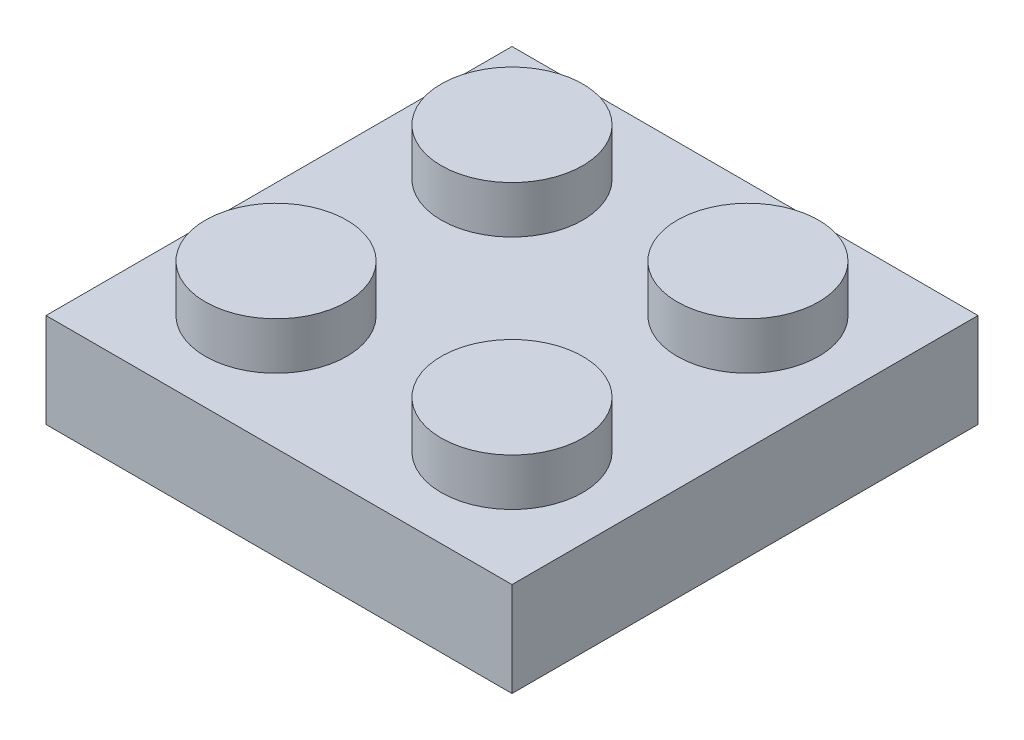
ISO-10303-21;
HEADER;
FILE_DESCRIPTION(('STEP AP214'),'2;1');
FILE_NAME('part.step','',(''),(''),'','','');
FILE_SCHEMA(('AUTOMOTIVE_DESIGN { 1 0 10303 214 1 1 1 1 }'));
ENDSEC;
DATA;
#1=APPLICATION_CONTEXT('core data for automotive mechanical design processes');
#2=APPLICATION_PROTOCOL_DEFINITION('international standard','automotive_design',2000,#1);
#3=PRODUCT_CONTEXT('',#1,'mechanical');
#4=PRODUCT('Part','Part','',(#3));
#5=PRODUCT_RELATED_PRODUCT_CATEGORY('part','',(#4));
#6=PRODUCT_DEFINITION_FORMATION('','',#4);
#7=PRODUCT_DEFINITION_CONTEXT('part definition',#1,'design');
#8=PRODUCT_DEFINITION('design','',#6,#7);
#9=PRODUCT_DEFINITION_SHAPE('','',#8);
#10=(LENGTH_UNIT() NAMED_UNIT(*) SI_UNIT(.MILLI.,.METRE.));
#11=(NAMED_UNIT(*) PLANE_ANGLE_UNIT() SI_UNIT($,.RADIAN.));
#12=(NAMED_UNIT(*) SI_UNIT($,.STERADIAN.) SOLID_ANGLE_UNIT());
#13=UNCERTAINTY_MEASURE_WITH_UNIT(LENGTH_MEASURE(1.E-05),#10,'distance_accuracy_value','');
#14=(GEOMETRIC_REPRESENTATION_CONTEXT(3) GLOBAL_UNCERTAINTY_ASSIGNED_CONTEXT((#13)) GLOBAL_UNIT_ASSIGNED_CONTEXT((#10,
#11,#12)) REPRESENTATION_CONTEXT('',''));
#15=CARTESIAN_POINT('',(0.,0.,0.));
#16=DIRECTION('',(0.,0.,1.));
#17=DIRECTION('',(1.,0.,0.));
#18=AXIS2_PLACEMENT_3D('',#15,#16,#17);
#19=CARTESIAN_POINT('',(0.,0.,-15.8));
#20=DIRECTION('',(0.,-1.,0.));
#21=DIRECTION('',(0.,0.,-1.));
#22=AXIS2_PLACEMENT_3D('',#19,#20,#21);
#23=PLANE('',#22);
#24=DIRECTION('',(1.,0.,0.));
#25=VECTOR('',#24,1.);
#26=CARTESIAN_POINT('',(0.,0.,0.));
#27=LINE('',#26,#25);
#28=CARTESIAN_POINT('',(0.,0.,0.));
#29=VERTEX_POINT('',#28);
#30=CARTESIAN_POINT('',(15.8,0.,0.));
#31=VERTEX_POINT('',#30);
#32=EDGE_CURVE('E221',#29,#31,#27,.T.);
#33=ORIENTED_EDGE('',*,*,#32,.F.);
#34=DIRECTION('',(0.,0.,1.));
#35=VECTOR('',#34,1.);
#36=CARTESIAN_POINT('',(0.,0.,-15.8));
#37=LINE('',#36,#35);
#38=CARTESIAN_POINT('',(0.,0.,-15.8));
#39=VERTEX_POINT('',#38);
#40=EDGE_CURVE('E92',#39,#29,#37,.T.);
#41=ORIENTED_EDGE('',*,*,#40,.F.);
#42=DIRECTION('',(1.,0.,0.));
#43=VECTOR('',#42,1.);
#44=CARTESIAN_POINT('',(0.,0.,-15.8));
#45=LINE('',#44,#43);
#46=CARTESIAN_POINT('',(15.8,0.,-15.8));
#47=VERTEX_POINT('',#46);
#48=EDGE_CURVE('E207',#39,#47,#45,.T.);
#49=ORIENTED_EDGE('',*,*,#48,.T.);
#50=DIRECTION('',(0.,0.,1.));
#51=VECTOR('',#50,1.);
#52=CARTESIAN_POINT('',(15.8,0.,-15.8));
#53=LINE('',#52,#51);
#54=EDGE_CURVE('E238',#47,#31,#53,.T.);
#55=ORIENTED_EDGE('',*,*,#54,.T.);
#56=EDGE_LOOP('',(#33,#41,#49,#55));
#57=FACE_BOUND('',#56,.T.);
#58=DIRECTION('',(0.,0.,1.));
#59=VECTOR('',#58,1.);
#60=CARTESIAN_POINT('',(1.2,0.,-15.8));
#61=LINE('',#60,#59);
#62=CARTESIAN_POINT('',(1.2,0.,-14.6));
#63=VERTEX_POINT('',#62);
#64=CARTESIAN_POINT('',(1.2,0.,-1.2));
#65=VERTEX_POINT('',#64);
#66=EDGE_CURVE('E140',#63,#65,#61,.T.);
#67=ORIENTED_EDGE('',*,*,#66,.T.);
#68=DIRECTION('',(1.,0.,0.));
#69=VECTOR('',#68,1.);
#70=CARTESIAN_POINT('',(0.,0.,-1.2));
#71=LINE('',#70,#69);
#72=CARTESIAN_POINT('',(14.6,0.,-1.2));
#73=VERTEX_POINT('',#72);
#74=EDGE_CURVE('E162',#65,#73,#71,.T.);
#75=ORIENTED_EDGE('',*,*,#74,.T.);
#76=DIRECTION('',(0.,0.,1.));
#77=VECTOR('',#76,1.);
#78=CARTESIAN_POINT('',(14.6,0.,-15.8));
#79=LINE('',#78,#77);
#80=CARTESIAN_POINT('',(14.6,0.,-14.6));
#81=VERTEX_POINT('',#80);
#82=EDGE_CURVE('E129',#81,#73,#79,.T.);
#83=ORIENTED_EDGE('',*,*,#82,.F.);
#84=DIRECTION('',(1.,0.,0.));
#85=VECTOR('',#84,1.);
#86=CARTESIAN_POINT('',(0.,0.,-14.6));
#87=LINE('',#86,#85);
#88=EDGE_CURVE('E57',#63,#81,#87,.T.);
#89=ORIENTED_EDGE('',*,*,#88,.F.);
#90=EDGE_LOOP('',(#67,#75,#83,#89));
#91=FACE_BOUND('',#90,.T.);
#92=ADVANCED_FACE('F41',(#57,#91),#23,.T.);
#93=CARTESIAN_POINT('',(11.9,4.8,-11.9));
#94=DIRECTION('',(0.,1.,0.));
#95=DIRECTION('',(0.,0.,1.));
#96=AXIS2_PLACEMENT_3D('',#93,#94,#95);
#97=PLANE('',#96);
#98=CARTESIAN_POINT('',(11.9,4.8,-11.9));
#99=DIRECTION('',(0.,1.,0.));
#100=DIRECTION('',(0.,0.,1.));
#101=AXIS2_PLACEMENT_3D('',#98,#99,#100);
#102=CIRCLE('',#101,2.4);
#103=CARTESIAN_POINT('',(11.9,4.8,-9.5));
#104=VERTEX_POINT('',#103);
#105=EDGE_CURVE('E50',#104,#104,#102,.T.);
#106=ORIENTED_EDGE('',*,*,#105,.T.);
#107=EDGE_LOOP('',(#106));
#108=FACE_BOUND('',#107,.T.);
#109=ADVANCED_FACE('F43',(#108),#97,.T.);
#110=CARTESIAN_POINT('',(11.9,4.8,-11.9));
#111=DIRECTION('',(0.,-1.,0.));
#112=DIRECTION('',(0.,0.,-1.));
#113=AXIS2_PLACEMENT_3D('',#110,#111,#112);
#114=CYLINDRICAL_SURFACE('',#113,2.4);
#115=ORIENTED_EDGE('',*,*,#105,.F.);
#116=EDGE_LOOP('',(#115));
#117=FACE_BOUND('',#116,.T.);
#118=CARTESIAN_POINT('',(11.9,3.2,-11.9));
#119=DIRECTION('',(0.,1.,0.));
#120=DIRECTION('',(0.,0.,1.));
#121=AXIS2_PLACEMENT_3D('',#118,#119,#120);
#122=CIRCLE('',#121,2.4);
#123=CARTESIAN_POINT('',(11.9,3.2,-9.5));
#124=VERTEX_POINT('',#123);
#125=EDGE_CURVE('E250',#124,#124,#122,.T.);
#126=ORIENTED_EDGE('',*,*,#125,.T.);
#127=EDGE_LOOP('',(#126));
#128=FACE_BOUND('',#127,.T.);
#129=ADVANCED_FACE('F258',(#117,#128),#114,.T.);
#130=CARTESIAN_POINT('',(11.9,4.8,-3.9));
#131=DIRECTION('',(0.,1.,0.));
#132=DIRECTION('',(0.,0.,1.));
#133=AXIS2_PLACEMENT_3D('',#130,#131,#132);
#134=PLANE('',#133);
#135=CARTESIAN_POINT('',(11.9,4.8,-3.9));
#136=DIRECTION('',(0.,1.,0.));
#137=DIRECTION('',(0.,0.,1.));
#138=AXIS2_PLACEMENT_3D('',#135,#136,#137);
#139=CIRCLE('',#138,2.4);
#140=CARTESIAN_POINT('',(11.9,4.8,-1.5));
#141=VERTEX_POINT('',#140);
#142=EDGE_CURVE('E246',#141,#141,#139,.T.);
#143=ORIENTED_EDGE('',*,*,#142,.T.);
#144=EDGE_LOOP('',(#143));
#145=FACE_BOUND('',#144,.T.);
#146=ADVANCED_FACE('F261',(#145),#134,.T.);
#147=CARTESIAN_POINT('',(11.9,4.8,-3.9));
#148=DIRECTION('',(0.,-1.,0.));
#149=DIRECTION('',(0.,0.,-1.));
#150=AXIS2_PLACEMENT_3D('',#147,#148,#149);
#151=CYLINDRICAL_SURFACE('',#150,2.4);
#152=ORIENTED_EDGE('',*,*,#142,.F.);
#153=EDGE_LOOP('',(#152));
#154=FACE_BOUND('',#153,.T.);
#155=CARTESIAN_POINT('',(11.9,3.2,-3.9));
#156=DIRECTION('',(0.,1.,0.));
#157=DIRECTION('',(0.,0.,1.));
#158=AXIS2_PLACEMENT_3D('',#155,#156,#157);
#159=CIRCLE('',#158,2.4);
#160=CARTESIAN_POINT('',(11.9,3.2,-1.5));
#161=VERTEX_POINT('',#160);
#162=EDGE_CURVE('E234',#161,#161,#159,.T.);
#163=ORIENTED_EDGE('',*,*,#162,.T.);
#164=EDGE_LOOP('',(#163));
#165=FACE_BOUND('',#164,.T.);
#166=ADVANCED_FACE('F277',(#154,#165),#151,.T.);
#167=CARTESIAN_POINT('',(0.,0.,-15.8));
#168=DIRECTION('',(-1.,0.,0.));
#169=DIRECTION('',(0.,0.,1.));
#170=AXIS2_PLACEMENT_3D('',#167,#168,#169);
#171=PLANE('',#170);
#172=DIRECTION('',(0.,-1.,0.));
#173=VECTOR('',#172,1.);
#174=CARTESIAN_POINT('',(0.,0.,0.));
#175=LINE('',#174,#173);
#176=CARTESIAN_POINT('',(0.,3.2,0.));
#177=VERTEX_POINT('',#176);
#178=EDGE_CURVE('E200',#177,#29,#175,.T.);
#179=ORIENTED_EDGE('',*,*,#178,.F.);
#180=DIRECTION('',(0.,0.,1.));
#181=VECTOR('',#180,1.);
#182=CARTESIAN_POINT('',(0.,3.2,-15.8));
#183=LINE('',#182,#181);
#184=CARTESIAN_POINT('',(0.,3.2,-15.8));
#185=VERTEX_POINT('',#184);
#186=EDGE_CURVE('E66',#185,#177,#183,.T.);
#187=ORIENTED_EDGE('',*,*,#186,.F.);
#188=DIRECTION('',(0.,-1.,0.));
#189=VECTOR('',#188,1.);
#190=CARTESIAN_POINT('',(0.,0.,-15.8));
#191=LINE('',#190,#189);
#192=EDGE_CURVE('E204',#185,#39,#191,.T.);
#193=ORIENTED_EDGE('',*,*,#192,.T.);
#194=ORIENTED_EDGE('',*,*,#40,.T.);
#195=EDGE_LOOP('',(#179,#187,#193,#194));
#196=FACE_BOUND('',#195,.T.);
#197=ADVANCED_FACE('F267',(#196),#171,.T.);
#198=CARTESIAN_POINT('',(0.,3.2,-15.8));
#199=DIRECTION('',(0.,1.,0.));
#200=DIRECTION('',(0.,0.,1.));
#201=AXIS2_PLACEMENT_3D('',#198,#199,#200);
#202=PLANE('',#201);
#203=CARTESIAN_POINT('',(3.9,3.2,-11.9));
#204=DIRECTION('',(0.,1.,0.));
#205=DIRECTION('',(0.,0.,1.));
#206=AXIS2_PLACEMENT_3D('',#203,#204,#205);
#207=CIRCLE('',#206,2.4);
#208=CARTESIAN_POINT('',(3.9,3.2,-9.5));
#209=VERTEX_POINT('',#208);
#210=EDGE_CURVE('E186',#209,#209,#207,.T.);
#211=ORIENTED_EDGE('',*,*,#210,.F.);
#212=EDGE_LOOP('',(#211));
#213=FACE_BOUND('',#212,.T.);
#214=CARTESIAN_POINT('',(3.9,3.2,-3.9));
#215=DIRECTION('',(0.,1.,0.));
#216=DIRECTION('',(0.,0.,1.));
#217=AXIS2_PLACEMENT_3D('',#214,#215,#216);
#218=CIRCLE('',#217,2.4);
#219=CARTESIAN_POINT('',(3.9,3.2,-1.5));
#220=VERTEX_POINT('',#219);
#221=EDGE_CURVE('E195',#220,#220,#218,.T.);
#222=ORIENTED_EDGE('',*,*,#221,.F.);
#223=EDGE_LOOP('',(#222));
#224=FACE_BOUND('',#223,.T.);
#225=DIRECTION('',(-1.,0.,0.));
#226=VECTOR('',#225,1.);
#227=CARTESIAN_POINT('',(0.,3.2,0.));
#228=LINE('',#227,#226);
#229=CARTESIAN_POINT('',(15.8,3.2,0.));
#230=VERTEX_POINT('',#229);
#231=EDGE_CURVE('E208',#230,#177,#228,.T.);
#232=ORIENTED_EDGE('',*,*,#231,.F.);
#233=DIRECTION('',(0.,0.,1.));
#234=VECTOR('',#233,1.);
#235=CARTESIAN_POINT('',(15.8,3.2,-15.8));
#236=LINE('',#235,#234);
#237=CARTESIAN_POINT('',(15.8,3.2,-15.8));
#238=VERTEX_POINT('',#237);
#239=EDGE_CURVE('E235',#238,#230,#236,.T.);
#240=ORIENTED_EDGE('',*,*,#239,.F.);
#241=DIRECTION('',(-1.,0.,0.));
#242=VECTOR('',#241,1.);
#243=CARTESIAN_POINT('',(0.,3.2,-15.8));
#244=LINE('',#243,#242);
#245=EDGE_CURVE('E215',#238,#185,#244,.T.);
#246=ORIENTED_EDGE('',*,*,#245,.T.);
#247=ORIENTED_EDGE('',*,*,#186,.T.);
#248=EDGE_LOOP('',(#232,#240,#246,#247));
#249=FACE_BOUND('',#248,.T.);
#250=ORIENTED_EDGE('',*,*,#162,.F.);
#251=EDGE_LOOP('',(#250));
#252=FACE_BOUND('',#251,.T.);
#253=ORIENTED_EDGE('',*,*,#125,.F.);
#254=EDGE_LOOP('',(#253));
#255=FACE_BOUND('',#254,.T.);
#256=ADVANCED_FACE('F264',(#213,#224,#249,#252,#255),#202,.T.);
#257=CARTESIAN_POINT('',(15.8,0.,-15.8));
#258=DIRECTION('',(1.,0.,0.));
#259=DIRECTION('',(0.,0.,-1.));
#260=AXIS2_PLACEMENT_3D('',#257,#258,#259);
#261=PLANE('',#260);
#262=DIRECTION('',(0.,1.,0.));
#263=VECTOR('',#262,1.);
#264=CARTESIAN_POINT('',(15.8,0.,0.));
#265=LINE('',#264,#263);
#266=EDGE_CURVE('E225',#31,#230,#265,.T.);
#267=ORIENTED_EDGE('',*,*,#266,.F.);
#268=ORIENTED_EDGE('',*,*,#54,.F.);
#269=DIRECTION('',(0.,1.,0.));
#270=VECTOR('',#269,1.);
#271=CARTESIAN_POINT('',(15.8,0.,-15.8));
#272=LINE('',#271,#270);
#273=EDGE_CURVE('E211',#47,#238,#272,.T.);
#274=ORIENTED_EDGE('',*,*,#273,.T.);
#275=ORIENTED_EDGE('',*,*,#239,.T.);
#276=EDGE_LOOP('',(#267,#268,#274,#275));
#277=FACE_BOUND('',#276,.T.);
#278=ADVANCED_FACE('F266',(#277),#261,.T.);
#279=CARTESIAN_POINT('',(0.,0.,-15.8));
#280=DIRECTION('',(0.,0.,-1.));
#281=DIRECTION('',(-1.,0.,0.));
#282=AXIS2_PLACEMENT_3D('',#279,#280,#281);
#283=PLANE('',#282);
#284=ORIENTED_EDGE('',*,*,#192,.F.);
#285=ORIENTED_EDGE('',*,*,#245,.F.);
#286=ORIENTED_EDGE('',*,*,#273,.F.);
#287=ORIENTED_EDGE('',*,*,#48,.F.);
#288=EDGE_LOOP('',(#284,#285,#286,#287));
#289=FACE_BOUND('',#288,.T.);
#290=ADVANCED_FACE('F274',(#289),#283,.T.);
#291=CARTESIAN_POINT('',(0.,0.,0.));
#292=DIRECTION('',(0.,0.,-1.));
#293=DIRECTION('',(-1.,0.,0.));
#294=AXIS2_PLACEMENT_3D('',#291,#292,#293);
#295=PLANE('',#294);
#296=ORIENTED_EDGE('',*,*,#178,.T.);
#297=ORIENTED_EDGE('',*,*,#32,.T.);
#298=ORIENTED_EDGE('',*,*,#266,.T.);
#299=ORIENTED_EDGE('',*,*,#231,.T.);
#300=EDGE_LOOP('',(#296,#297,#298,#299));
#301=FACE_BOUND('',#300,.T.);
#302=ADVANCED_FACE('F326',(#301),#295,.F.);
#303=CARTESIAN_POINT('',(3.9,4.8,-3.9));
#304=DIRECTION('',(0.,-1.,0.));
#305=DIRECTION('',(0.,0.,-1.));
#306=AXIS2_PLACEMENT_3D('',#303,#304,#305);
#307=CYLINDRICAL_SURFACE('',#306,2.4);
#308=CARTESIAN_POINT('',(3.9,4.8,-3.9));
#309=DIRECTION('',(0.,1.,0.));
#310=DIRECTION('',(0.,0.,1.));
#311=AXIS2_PLACEMENT_3D('',#308,#309,#310);
#312=CIRCLE('',#311,2.4);
#313=CARTESIAN_POINT('',(3.9,4.8,-1.5));
#314=VERTEX_POINT('',#313);
#315=EDGE_CURVE('E196',#314,#314,#312,.T.);
#316=ORIENTED_EDGE('',*,*,#315,.F.);
#317=EDGE_LOOP('',(#316));
#318=FACE_BOUND('',#317,.T.);
#319=ORIENTED_EDGE('',*,*,#221,.T.);
#320=EDGE_LOOP('',(#319));
#321=FACE_BOUND('',#320,.T.);
#322=ADVANCED_FACE('F336',(#318,#321),#307,.T.);
#323=CARTESIAN_POINT('',(3.9,4.8,-3.9));
#324=DIRECTION('',(0.,1.,0.));
#325=DIRECTION('',(0.,0.,1.));
#326=AXIS2_PLACEMENT_3D('',#323,#324,#325);
#327=PLANE('',#326);
#328=ORIENTED_EDGE('',*,*,#315,.T.);
#329=EDGE_LOOP('',(#328));
#330=FACE_BOUND('',#329,.T.);
#331=ADVANCED_FACE('F345',(#330),#327,.T.);
#332=CARTESIAN_POINT('',(3.9,4.8,-11.9));
#333=DIRECTION('',(0.,-1.,0.));
#334=DIRECTION('',(0.,0.,-1.));
#335=AXIS2_PLACEMENT_3D('',#332,#333,#334);
#336=CYLINDRICAL_SURFACE('',#335,2.4);
#337=CARTESIAN_POINT('',(3.9,4.8,-11.9));
#338=DIRECTION('',(0.,1.,0.));
#339=DIRECTION('',(0.,0.,1.));
#340=AXIS2_PLACEMENT_3D('',#337,#338,#339);
#341=CIRCLE('',#340,2.4);
#342=CARTESIAN_POINT('',(3.9,4.8,-9.5));
#343=VERTEX_POINT('',#342);
#344=EDGE_CURVE('E190',#343,#343,#341,.T.);
#345=ORIENTED_EDGE('',*,*,#344,.F.);
#346=EDGE_LOOP('',(#345));
#347=FACE_BOUND('',#346,.T.);
#348=ORIENTED_EDGE('',*,*,#210,.T.);
#349=EDGE_LOOP('',(#348));
#350=FACE_BOUND('',#349,.T.);
#351=ADVANCED_FACE('F355',(#347,#350),#336,.T.);
#352=CARTESIAN_POINT('',(3.9,4.8,-11.9));
#353=DIRECTION('',(0.,1.,0.));
#354=DIRECTION('',(0.,0.,1.));
#355=AXIS2_PLACEMENT_3D('',#352,#353,#354);
#356=PLANE('',#355);
#357=ORIENTED_EDGE('',*,*,#344,.T.);
#358=EDGE_LOOP('',(#357));
#359=FACE_BOUND('',#358,.T.);
#360=ADVANCED_FACE('F380',(#359),#356,.T.);
#361=CARTESIAN_POINT('',(11.9,3.6,-11.9));
#362=DIRECTION('',(0.,1.,0.));
#363=DIRECTION('',(0.,0.,1.));
#364=AXIS2_PLACEMENT_3D('',#361,#362,#363);
#365=PLANE('',#364);
#366=CARTESIAN_POINT('',(11.9,3.6,-11.9));
#367=DIRECTION('',(0.,1.,0.));
#368=DIRECTION('',(0.,0.,1.));
#369=AXIS2_PLACEMENT_3D('',#366,#367,#368);
#370=CIRCLE('',#369,1.2);
#371=CARTESIAN_POINT('',(11.9,3.6,-10.7));
#372=VERTEX_POINT('',#371);
#373=EDGE_CURVE('E191',#372,#372,#370,.T.);
#374=ORIENTED_EDGE('',*,*,#373,.F.);
#375=EDGE_LOOP('',(#374));
#376=FACE_BOUND('',#375,.T.);
#377=ADVANCED_FACE('F389',(#376),#365,.F.);
#378=CARTESIAN_POINT('',(11.9,4.8,-11.9));
#379=DIRECTION('',(0.,-1.,0.));
#380=DIRECTION('',(0.,0.,-1.));
#381=AXIS2_PLACEMENT_3D('',#378,#379,#380);
#382=CYLINDRICAL_SURFACE('',#381,1.2);
#383=ORIENTED_EDGE('',*,*,#373,.T.);
#384=EDGE_LOOP('',(#383));
#385=FACE_BOUND('',#384,.T.);
#386=CARTESIAN_POINT('',(11.9,2.,-11.9));
#387=DIRECTION('',(0.,1.,0.));
#388=DIRECTION('',(0.,0.,1.));
#389=AXIS2_PLACEMENT_3D('',#386,#387,#388);
#390=CIRCLE('',#389,1.2);
#391=CARTESIAN_POINT('',(11.9,2.,-10.7));
#392=VERTEX_POINT('',#391);
#393=EDGE_CURVE('E157',#392,#392,#390,.T.);
#394=ORIENTED_EDGE('',*,*,#393,.F.);
#395=EDGE_LOOP('',(#394));
#396=FACE_BOUND('',#395,.T.);
#397=ADVANCED_FACE('F402',(#385,#396),#382,.F.);
#398=CARTESIAN_POINT('',(11.9,3.6,-3.9));
#399=DIRECTION('',(0.,1.,0.));
#400=DIRECTION('',(0.,0.,1.));
#401=AXIS2_PLACEMENT_3D('',#398,#399,#400);
#402=PLANE('',#401);
#403=CARTESIAN_POINT('',(11.9,3.6,-3.9));
#404=DIRECTION('',(0.,1.,0.));
#405=DIRECTION('',(0.,0.,1.));
#406=AXIS2_PLACEMENT_3D('',#403,#404,#405);
#407=CIRCLE('',#406,1.2);
#408=CARTESIAN_POINT('',(11.9,3.6,-2.7));
#409=VERTEX_POINT('',#408);
#410=EDGE_CURVE('E153',#409,#409,#407,.T.);
#411=ORIENTED_EDGE('',*,*,#410,.F.);
#412=EDGE_LOOP('',(#411));
#413=FACE_BOUND('',#412,.T.);
#414=ADVANCED_FACE('F411',(#413),#402,.F.);
#415=CARTESIAN_POINT('',(11.9,4.8,-3.9));
#416=DIRECTION('',(0.,-1.,0.));
#417=DIRECTION('',(0.,0.,-1.));
#418=AXIS2_PLACEMENT_3D('',#415,#416,#417);
#419=CYLINDRICAL_SURFACE('',#418,1.2);
#420=ORIENTED_EDGE('',*,*,#410,.T.);
#421=EDGE_LOOP('',(#420));
#422=FACE_BOUND('',#421,.T.);
#423=CARTESIAN_POINT('',(11.9,2.,-3.9));
#424=DIRECTION('',(0.,1.,0.));
#425=DIRECTION('',(0.,0.,1.));
#426=AXIS2_PLACEMENT_3D('',#423,#424,#425);
#427=CIRCLE('',#426,1.2);
#428=CARTESIAN_POINT('',(11.9,2.,-2.7));
#429=VERTEX_POINT('',#428);
#430=EDGE_CURVE('E149',#429,#429,#427,.T.);
#431=ORIENTED_EDGE('',*,*,#430,.F.);
#432=EDGE_LOOP('',(#431));
#433=FACE_BOUND('',#432,.T.);
#434=ADVANCED_FACE('F420',(#422,#433),#419,.F.);
#435=CARTESIAN_POINT('',(1.2,0.,-15.8));
#436=DIRECTION('',(-1.,0.,0.));
#437=DIRECTION('',(0.,0.,1.));
#438=AXIS2_PLACEMENT_3D('',#435,#436,#437);
#439=PLANE('',#438);
#440=DIRECTION('',(0.,-1.,0.));
#441=VECTOR('',#440,1.);
#442=CARTESIAN_POINT('',(1.2,0.,-1.2));
#443=LINE('',#442,#441);
#444=CARTESIAN_POINT('',(1.2,2.,-1.2));
#445=VERTEX_POINT('',#444);
#446=EDGE_CURVE('E158',#445,#65,#443,.T.);
#447=ORIENTED_EDGE('',*,*,#446,.T.);
#448=ORIENTED_EDGE('',*,*,#66,.F.);
#449=DIRECTION('',(0.,-1.,0.));
#450=VECTOR('',#449,1.);
#451=CARTESIAN_POINT('',(1.2,0.,-14.6));
#452=LINE('',#451,#450);
#453=CARTESIAN_POINT('',(1.2,2.,-14.6));
#454=VERTEX_POINT('',#453);
#455=EDGE_CURVE('E164',#454,#63,#452,.T.);
#456=ORIENTED_EDGE('',*,*,#455,.F.);
#457=DIRECTION('',(0.,0.,1.));
#458=VECTOR('',#457,1.);
#459=CARTESIAN_POINT('',(1.2,2.,-15.8));
#460=LINE('',#459,#458);
#461=EDGE_CURVE('E128',#454,#445,#460,.T.);
#462=ORIENTED_EDGE('',*,*,#461,.T.);
#463=EDGE_LOOP('',(#447,#448,#456,#462));
#464=FACE_BOUND('',#463,.T.);
#465=ADVANCED_FACE('F429',(#464),#439,.F.);
#466=CARTESIAN_POINT('',(0.,2.,-15.8));
#467=DIRECTION('',(0.,1.,0.));
#468=DIRECTION('',(0.,0.,1.));
#469=AXIS2_PLACEMENT_3D('',#466,#467,#468);
#470=PLANE('',#469);
#471=CARTESIAN_POINT('',(7.9,2.,-7.9));
#472=DIRECTION('',(0.,1.,0.));
#473=DIRECTION('',(0.,0.,1.));
#474=AXIS2_PLACEMENT_3D('',#471,#472,#473);
#475=CIRCLE('',#474,3.25);
#476=CARTESIAN_POINT('',(7.9,2.,-4.65));
#477=VERTEX_POINT('',#476);
#478=EDGE_CURVE('E12',#477,#477,#475,.F.);
#479=ORIENTED_EDGE('',*,*,#478,.F.);
#480=EDGE_LOOP('',(#479));
#481=FACE_BOUND('',#480,.T.);
#482=CARTESIAN_POINT('',(3.9,2.,-11.9));
#483=DIRECTION('',(0.,1.,0.));
#484=DIRECTION('',(0.,0.,1.));
#485=AXIS2_PLACEMENT_3D('',#482,#483,#484);
#486=CIRCLE('',#485,1.2);
#487=CARTESIAN_POINT('',(3.9,2.,-10.7));
#488=VERTEX_POINT('',#487);
#489=EDGE_CURVE('E177',#488,#488,#486,.T.);
#490=ORIENTED_EDGE('',*,*,#489,.T.);
#491=EDGE_LOOP('',(#490));
#492=FACE_BOUND('',#491,.T.);
#493=CARTESIAN_POINT('',(3.9,2.,-3.9));
#494=DIRECTION('',(0.,1.,0.));
#495=DIRECTION('',(0.,0.,1.));
#496=AXIS2_PLACEMENT_3D('',#493,#494,#495);
#497=CIRCLE('',#496,1.2);
#498=CARTESIAN_POINT('',(3.9,2.,-2.7));
#499=VERTEX_POINT('',#498);
#500=EDGE_CURVE('E173',#499,#499,#497,.T.);
#501=ORIENTED_EDGE('',*,*,#500,.T.);
#502=EDGE_LOOP('',(#501));
#503=FACE_BOUND('',#502,.T.);
#504=DIRECTION('',(-1.,0.,0.));
#505=VECTOR('',#504,1.);
#506=CARTESIAN_POINT('',(0.,2.,-1.2));
#507=LINE('',#506,#505);
#508=CARTESIAN_POINT('',(14.6,2.,-1.2));
#509=VERTEX_POINT('',#508);
#510=EDGE_CURVE('E166',#509,#445,#507,.T.);
#511=ORIENTED_EDGE('',*,*,#510,.T.);
#512=ORIENTED_EDGE('',*,*,#461,.F.);
#513=DIRECTION('',(-1.,0.,0.));
#514=VECTOR('',#513,1.);
#515=CARTESIAN_POINT('',(0.,2.,-14.6));
#516=LINE('',#515,#514);
#517=CARTESIAN_POINT('',(14.6,2.,-14.6));
#518=VERTEX_POINT('',#517);
#519=EDGE_CURVE('E133',#518,#454,#516,.T.);
#520=ORIENTED_EDGE('',*,*,#519,.F.);
#521=DIRECTION('',(0.,0.,1.));
#522=VECTOR('',#521,1.);
#523=CARTESIAN_POINT('',(14.6,2.,-15.8));
#524=LINE('',#523,#522);
#525=EDGE_CURVE('E117',#518,#509,#524,.T.);
#526=ORIENTED_EDGE('',*,*,#525,.T.);
#527=EDGE_LOOP('',(#511,#512,#520,#526));
#528=FACE_BOUND('',#527,.T.);
#529=ORIENTED_EDGE('',*,*,#430,.T.);
#530=EDGE_LOOP('',(#529));
#531=FACE_BOUND('',#530,.T.);
#532=ORIENTED_EDGE('',*,*,#393,.T.);
#533=EDGE_LOOP('',(#532));
#534=FACE_BOUND('',#533,.T.);
#535=ADVANCED_FACE('F136',(#481,#492,#503,#528,#531,#534),#470,.F.);
#536=CARTESIAN_POINT('',(14.6,0.,-15.8));
#537=DIRECTION('',(1.,0.,0.));
#538=DIRECTION('',(0.,0.,-1.));
#539=AXIS2_PLACEMENT_3D('',#536,#537,#538);
#540=PLANE('',#539);
#541=DIRECTION('',(0.,1.,0.));
#542=VECTOR('',#541,1.);
#543=CARTESIAN_POINT('',(14.6,0.,-1.2));
#544=LINE('',#543,#542);
#545=EDGE_CURVE('E122',#73,#509,#544,.T.);
#546=ORIENTED_EDGE('',*,*,#545,.T.);
#547=ORIENTED_EDGE('',*,*,#525,.F.);
#548=DIRECTION('',(0.,1.,0.));
#549=VECTOR('',#548,1.);
#550=CARTESIAN_POINT('',(14.6,0.,-14.6));
#551=LINE('',#550,#549);
#552=EDGE_CURVE('E119',#81,#518,#551,.T.);
#553=ORIENTED_EDGE('',*,*,#552,.F.);
#554=ORIENTED_EDGE('',*,*,#82,.T.);
#555=EDGE_LOOP('',(#546,#547,#553,#554));
#556=FACE_BOUND('',#555,.T.);
#557=ADVANCED_FACE('F118',(#556),#540,.F.);
#558=CARTESIAN_POINT('',(0.,0.,-14.6));
#559=DIRECTION('',(0.,0.,-1.));
#560=DIRECTION('',(-1.,0.,0.));
#561=AXIS2_PLACEMENT_3D('',#558,#559,#560);
#562=PLANE('',#561);
#563=ORIENTED_EDGE('',*,*,#455,.T.);
#564=ORIENTED_EDGE('',*,*,#88,.T.);
#565=ORIENTED_EDGE('',*,*,#552,.T.);
#566=ORIENTED_EDGE('',*,*,#519,.T.);
#567=EDGE_LOOP('',(#563,#564,#565,#566));
#568=FACE_BOUND('',#567,.T.);
#569=ADVANCED_FACE('F132',(#568),#562,.F.);
#570=CARTESIAN_POINT('',(0.,0.,-1.2));
#571=DIRECTION('',(0.,0.,-1.));
#572=DIRECTION('',(-1.,0.,0.));
#573=AXIS2_PLACEMENT_3D('',#570,#571,#572);
#574=PLANE('',#573);
#575=ORIENTED_EDGE('',*,*,#446,.F.);
#576=ORIENTED_EDGE('',*,*,#510,.F.);
#577=ORIENTED_EDGE('',*,*,#545,.F.);
#578=ORIENTED_EDGE('',*,*,#74,.F.);
#579=EDGE_LOOP('',(#575,#576,#577,#578));
#580=FACE_BOUND('',#579,.T.);
#581=ADVANCED_FACE('F464',(#580),#574,.T.);
#582=CARTESIAN_POINT('',(3.9,4.8,-3.9));
#583=DIRECTION('',(0.,-1.,0.));
#584=DIRECTION('',(0.,0.,-1.));
#585=AXIS2_PLACEMENT_3D('',#582,#583,#584);
#586=CYLINDRICAL_SURFACE('',#585,1.2);
#587=CARTESIAN_POINT('',(3.9,3.6,-3.9));
#588=DIRECTION('',(0.,1.,0.));
#589=DIRECTION('',(0.,0.,1.));
#590=AXIS2_PLACEMENT_3D('',#587,#588,#589);
#591=CIRCLE('',#590,1.2);
#592=CARTESIAN_POINT('',(3.9,3.6,-2.7));
#593=VERTEX_POINT('',#592);
#594=EDGE_CURVE('E163',#593,#593,#591,.T.);
#595=ORIENTED_EDGE('',*,*,#594,.T.);
#596=EDGE_LOOP('',(#595));
#597=FACE_BOUND('',#596,.T.);
#598=ORIENTED_EDGE('',*,*,#500,.F.);
#599=EDGE_LOOP('',(#598));
#600=FACE_BOUND('',#599,.T.);
#601=ADVANCED_FACE('F472',(#597,#600),#586,.F.);
#602=CARTESIAN_POINT('',(3.9,3.6,-3.9));
#603=DIRECTION('',(0.,1.,0.));
#604=DIRECTION('',(0.,0.,1.));
#605=AXIS2_PLACEMENT_3D('',#602,#603,#604);
#606=PLANE('',#605);
#607=ORIENTED_EDGE('',*,*,#594,.F.);
#608=EDGE_LOOP('',(#607));
#609=FACE_BOUND('',#608,.T.);
#610=ADVANCED_FACE('F481',(#609),#606,.F.);
#611=CARTESIAN_POINT('',(3.9,4.8,-11.9));
#612=DIRECTION('',(0.,-1.,0.));
#613=DIRECTION('',(0.,0.,-1.));
#614=AXIS2_PLACEMENT_3D('',#611,#612,#613);
#615=CYLINDRICAL_SURFACE('',#614,1.2);
#616=CARTESIAN_POINT('',(3.9,3.6,-11.9));
#617=DIRECTION('',(0.,1.,0.));
#618=DIRECTION('',(0.,0.,1.));
#619=AXIS2_PLACEMENT_3D('',#616,#617,#618);
#620=CIRCLE('',#619,1.2);
#621=CARTESIAN_POINT('',(3.9,3.6,-10.7));
#622=VERTEX_POINT('',#621);
#623=EDGE_CURVE('E174',#622,#622,#620,.T.);
#624=ORIENTED_EDGE('',*,*,#623,.T.);
#625=EDGE_LOOP('',(#624));
#626=FACE_BOUND('',#625,.T.);
#627=ORIENTED_EDGE('',*,*,#489,.F.);
#628=EDGE_LOOP('',(#627));
#629=FACE_BOUND('',#628,.T.);
#630=ADVANCED_FACE('F490',(#626,#629),#615,.F.);
#631=CARTESIAN_POINT('',(3.9,3.6,-11.9));
#632=DIRECTION('',(0.,1.,0.));
#633=DIRECTION('',(0.,0.,1.));
#634=AXIS2_PLACEMENT_3D('',#631,#632,#633);
#635=PLANE('',#634);
#636=ORIENTED_EDGE('',*,*,#623,.F.);
#637=EDGE_LOOP('',(#636));
#638=FACE_BOUND('',#637,.T.);
#639=ADVANCED_FACE('F499',(#638),#635,.F.);
#640=CARTESIAN_POINT('',(7.9,-9.19238815542512,-7.9));
#641=DIRECTION('',(0.,1.,0.));
#642=DIRECTION('',(0.,0.,1.));
#643=AXIS2_PLACEMENT_3D('',#640,#641,#642);
#644=CYLINDRICAL_SURFACE('',#643,3.25);
#645=ORIENTED_EDGE('',*,*,#478,.T.);
#646=EDGE_LOOP('',(#645));
#647=FACE_BOUND('',#646,.T.);
#648=CARTESIAN_POINT('',(7.9,0.200000000000001,-7.9));
#649=DIRECTION('',(0.,-1.,0.));
#650=DIRECTION('',(0.,0.,-1.));
#651=AXIS2_PLACEMENT_3D('',#648,#649,#650);
#652=CIRCLE('',#651,3.25);
#653=CARTESIAN_POINT('',(7.9,0.200000000000001,-11.15));
#654=VERTEX_POINT('',#653);
#655=EDGE_CURVE('E567',#654,#654,#652,.T.);
#656=ORIENTED_EDGE('',*,*,#655,.F.);
#657=EDGE_LOOP('',(#656));
#658=FACE_BOUND('',#657,.T.);
#659=ADVANCED_FACE('F507',(#647,#658),#644,.T.);
#660=CARTESIAN_POINT('',(7.9,-9.19238815542512,-7.9));
#661=DIRECTION('',(0.,1.,0.));
#662=DIRECTION('',(0.,0.,1.));
#663=AXIS2_PLACEMENT_3D('',#660,#661,#662);
#664=CYLINDRICAL_SURFACE('',#663,2.4);
#665=CARTESIAN_POINT('',(7.9,2.,-7.9));
#666=DIRECTION('',(0.,-1.,0.));
#667=DIRECTION('',(0.,0.,-1.));
#668=AXIS2_PLACEMENT_3D('',#665,#666,#667);
#669=CIRCLE('',#668,2.4);
#670=CARTESIAN_POINT('',(7.9,2.,-10.3));
#671=VERTEX_POINT('',#670);
#672=EDGE_CURVE('E570',#671,#671,#669,.T.);
#673=ORIENTED_EDGE('',*,*,#672,.F.);
#674=EDGE_LOOP('',(#673));
#675=FACE_BOUND('',#674,.T.);
#676=CARTESIAN_POINT('',(7.9,0.200000000000001,-7.9));
#677=DIRECTION('',(0.,-1.,0.));
#678=DIRECTION('',(0.,0.,-1.));
#679=AXIS2_PLACEMENT_3D('',#676,#677,#678);
#680=CIRCLE('',#679,2.4);
#681=CARTESIAN_POINT('',(7.9,0.200000000000001,-10.3));
#682=VERTEX_POINT('',#681);
#683=EDGE_CURVE('E564',#682,#682,#680,.T.);
#684=ORIENTED_EDGE('',*,*,#683,.T.);
#685=EDGE_LOOP('',(#684));
#686=FACE_BOUND('',#685,.T.);
#687=ADVANCED_FACE('F524',(#675,#686),#664,.F.);
#688=CARTESIAN_POINT('',(0.,0.2,-15.8));
#689=DIRECTION('',(0.,-1.,0.));
#690=DIRECTION('',(0.,0.,-1.));
#691=AXIS2_PLACEMENT_3D('',#688,#689,#690);
#692=PLANE('',#691);
#693=ORIENTED_EDGE('',*,*,#683,.F.);
#694=EDGE_LOOP('',(#693));
#695=FACE_BOUND('',#694,.T.);
#696=ORIENTED_EDGE('',*,*,#655,.T.);
#697=EDGE_LOOP('',(#696));
#698=FACE_BOUND('',#697,.T.);
#699=ADVANCED_FACE('F516',(#695,#698),#692,.T.);
#700=ORIENTED_EDGE('',*,*,#672,.T.);
#701=EDGE_LOOP('',(#700));
#702=FACE_BOUND('',#701,.T.);
#703=ADVANCED_FACE('F449',(#702),#470,.F.);
#704=CLOSED_SHELL('',(#92,#109,#129,#146,#166,#197,#256,#278,#290,#302,#322,#331,#351,#360,#377,
#397,#414,#434,#465,#535,#557,#569,#581,#601,#610,#630,#639,#659,#687,#699,#703));
#705=MANIFOLD_SOLID_BREP('B2',#704);
#706=ADVANCED_BREP_SHAPE_REPRESENTATION('',(#18,#705),#14);
#707=SHAPE_DEFINITION_REPRESENTATION(#9,#706);
ENDSEC;
END-ISO-10303-21;
